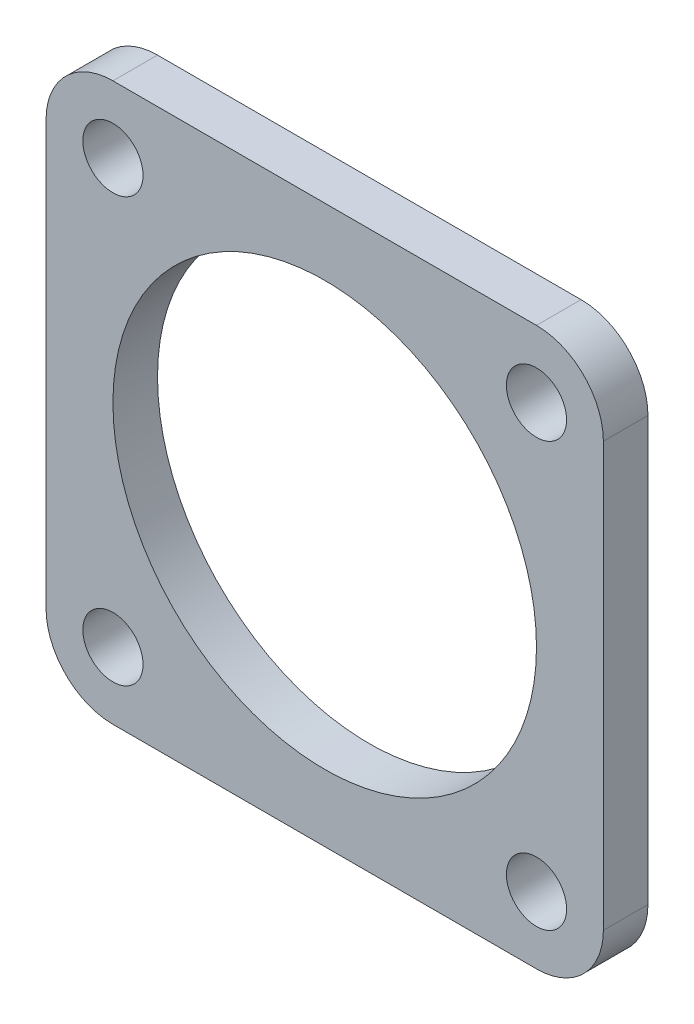
ISO-10303-21;
HEADER;
FILE_DESCRIPTION(('STEP AP214'),'2;1');
FILE_NAME('part.step','',(''),(''),'','','');
FILE_SCHEMA(('AUTOMOTIVE_DESIGN { 1 0 10303 214 1 1 1 1 }'));
ENDSEC;
DATA;
#1=APPLICATION_CONTEXT('core data for automotive mechanical design processes');
#2=APPLICATION_PROTOCOL_DEFINITION('international standard','automotive_design',2000,#1);
#3=PRODUCT_CONTEXT('',#1,'mechanical');
#4=PRODUCT('Part','Part','',(#3));
#5=PRODUCT_RELATED_PRODUCT_CATEGORY('part','',(#4));
#6=PRODUCT_DEFINITION_FORMATION('','',#4);
#7=PRODUCT_DEFINITION_CONTEXT('part definition',#1,'design');
#8=PRODUCT_DEFINITION('design','',#6,#7);
#9=PRODUCT_DEFINITION_SHAPE('','',#8);
#10=(LENGTH_UNIT() NAMED_UNIT(*) SI_UNIT(.MILLI.,.METRE.));
#11=(NAMED_UNIT(*) PLANE_ANGLE_UNIT() SI_UNIT($,.RADIAN.));
#12=(NAMED_UNIT(*) SI_UNIT($,.STERADIAN.) SOLID_ANGLE_UNIT());
#13=UNCERTAINTY_MEASURE_WITH_UNIT(LENGTH_MEASURE(1.E-05),#10,'distance_accuracy_value','');
#14=(GEOMETRIC_REPRESENTATION_CONTEXT(3) GLOBAL_UNCERTAINTY_ASSIGNED_CONTEXT((#13)) GLOBAL_UNIT_ASSIGNED_CONTEXT((#10,
#11,#12)) REPRESENTATION_CONTEXT('',''));
#15=CARTESIAN_POINT('',(0.,0.,0.));
#16=DIRECTION('',(0.,0.,1.));
#17=DIRECTION('',(1.,0.,0.));
#18=AXIS2_PLACEMENT_3D('',#15,#16,#17);
#19=CARTESIAN_POINT('',(0.,0.,1.));
#20=DIRECTION('',(0.,0.,-1.));
#21=DIRECTION('',(-1.,0.,0.));
#22=AXIS2_PLACEMENT_3D('',#19,#20,#21);
#23=PLANE('',#22);
#24=DIRECTION('',(1.,0.,0.));
#25=VECTOR('',#24,1.);
#26=CARTESIAN_POINT('',(-12.5,-12.5,1.));
#27=LINE('',#26,#25);
#28=CARTESIAN_POINT('',(-9.5,-12.5,1.));
#29=VERTEX_POINT('',#28);
#30=CARTESIAN_POINT('',(9.5,-12.5,1.));
#31=VERTEX_POINT('',#30);
#32=EDGE_CURVE('E146',#29,#31,#27,.T.);
#33=ORIENTED_EDGE('',*,*,#32,.T.);
#34=CARTESIAN_POINT('',(9.5,-9.5,1.));
#35=DIRECTION('',(0.,0.,-1.));
#36=DIRECTION('',(-1.,0.,0.));
#37=AXIS2_PLACEMENT_3D('',#34,#35,#36);
#38=CIRCLE('',#37,3.);
#39=CARTESIAN_POINT('',(12.5,-9.5,1.));
#40=VERTEX_POINT('',#39);
#41=EDGE_CURVE('E164',#31,#40,#38,.F.);
#42=ORIENTED_EDGE('',*,*,#41,.T.);
#43=DIRECTION('',(0.,1.,0.));
#44=VECTOR('',#43,1.);
#45=CARTESIAN_POINT('',(12.5,-12.5,1.));
#46=LINE('',#45,#44);
#47=CARTESIAN_POINT('',(12.5,9.5,1.));
#48=VERTEX_POINT('',#47);
#49=EDGE_CURVE('E128',#40,#48,#46,.T.);
#50=ORIENTED_EDGE('',*,*,#49,.T.);
#51=CARTESIAN_POINT('',(9.5,9.5,1.));
#52=DIRECTION('',(0.,0.,-1.));
#53=DIRECTION('',(-1.,0.,0.));
#54=AXIS2_PLACEMENT_3D('',#51,#52,#53);
#55=CIRCLE('',#54,3.);
#56=CARTESIAN_POINT('',(9.5,12.5,1.));
#57=VERTEX_POINT('',#56);
#58=EDGE_CURVE('E160',#48,#57,#55,.F.);
#59=ORIENTED_EDGE('',*,*,#58,.T.);
#60=DIRECTION('',(-1.,0.,0.));
#61=VECTOR('',#60,1.);
#62=CARTESIAN_POINT('',(-12.5,12.5,1.));
#63=LINE('',#62,#61);
#64=CARTESIAN_POINT('',(-9.5,12.5,1.));
#65=VERTEX_POINT('',#64);
#66=EDGE_CURVE('E173',#57,#65,#63,.T.);
#67=ORIENTED_EDGE('',*,*,#66,.T.);
#68=CARTESIAN_POINT('',(-9.5,9.5,1.));
#69=DIRECTION('',(0.,0.,-1.));
#70=DIRECTION('',(-1.,0.,0.));
#71=AXIS2_PLACEMENT_3D('',#68,#69,#70);
#72=CIRCLE('',#71,3.);
#73=CARTESIAN_POINT('',(-12.5,9.5,1.));
#74=VERTEX_POINT('',#73);
#75=EDGE_CURVE('E63',#65,#74,#72,.F.);
#76=ORIENTED_EDGE('',*,*,#75,.T.);
#77=DIRECTION('',(0.,-1.,0.));
#78=VECTOR('',#77,1.);
#79=CARTESIAN_POINT('',(-12.5,-12.5,1.));
#80=LINE('',#79,#78);
#81=CARTESIAN_POINT('',(-12.5,-9.5,1.));
#82=VERTEX_POINT('',#81);
#83=EDGE_CURVE('E179',#74,#82,#80,.T.);
#84=ORIENTED_EDGE('',*,*,#83,.T.);
#85=CARTESIAN_POINT('',(-9.5,-9.5,1.));
#86=DIRECTION('',(0.,0.,-1.));
#87=DIRECTION('',(-1.,0.,0.));
#88=AXIS2_PLACEMENT_3D('',#85,#86,#87);
#89=CIRCLE('',#88,3.);
#90=EDGE_CURVE('E162',#82,#29,#89,.F.);
#91=ORIENTED_EDGE('',*,*,#90,.T.);
#92=EDGE_LOOP('',(#33,#42,#50,#59,#67,#76,#84,#91));
#93=FACE_BOUND('',#92,.T.);
#94=CARTESIAN_POINT('',(-9.5,9.5,1.));
#95=DIRECTION('',(0.,0.,1.));
#96=DIRECTION('',(1.,0.,0.));
#97=AXIS2_PLACEMENT_3D('',#94,#95,#96);
#98=CIRCLE('',#97,1.35);
#99=CARTESIAN_POINT('',(-8.15,9.5,1.));
#100=VERTEX_POINT('',#99);
#101=EDGE_CURVE('E137',#100,#100,#98,.T.);
#102=ORIENTED_EDGE('',*,*,#101,.F.);
#103=EDGE_LOOP('',(#102));
#104=FACE_BOUND('',#103,.T.);
#105=CARTESIAN_POINT('',(9.5,9.50000000000001,1.));
#106=DIRECTION('',(0.,0.,1.));
#107=DIRECTION('',(1.,0.,0.));
#108=AXIS2_PLACEMENT_3D('',#105,#106,#107);
#109=CIRCLE('',#108,1.35);
#110=CARTESIAN_POINT('',(10.85,9.50000000000001,1.));
#111=VERTEX_POINT('',#110);
#112=EDGE_CURVE('E194',#111,#111,#109,.T.);
#113=ORIENTED_EDGE('',*,*,#112,.F.);
#114=EDGE_LOOP('',(#113));
#115=FACE_BOUND('',#114,.T.);
#116=CARTESIAN_POINT('',(9.5,-9.5,1.));
#117=DIRECTION('',(0.,0.,1.));
#118=DIRECTION('',(1.,0.,0.));
#119=AXIS2_PLACEMENT_3D('',#116,#117,#118);
#120=CIRCLE('',#119,1.35);
#121=CARTESIAN_POINT('',(10.85,-9.5,1.));
#122=VERTEX_POINT('',#121);
#123=EDGE_CURVE('E199',#122,#122,#120,.T.);
#124=ORIENTED_EDGE('',*,*,#123,.F.);
#125=EDGE_LOOP('',(#124));
#126=FACE_BOUND('',#125,.T.);
#127=CARTESIAN_POINT('',(-9.5,-9.5,1.));
#128=DIRECTION('',(0.,0.,1.));
#129=DIRECTION('',(1.,0.,0.));
#130=AXIS2_PLACEMENT_3D('',#127,#128,#129);
#131=CIRCLE('',#130,1.35);
#132=CARTESIAN_POINT('',(-8.15,-9.5,1.));
#133=VERTEX_POINT('',#132);
#134=EDGE_CURVE('E205',#133,#133,#131,.T.);
#135=ORIENTED_EDGE('',*,*,#134,.F.);
#136=EDGE_LOOP('',(#135));
#137=FACE_BOUND('',#136,.T.);
#138=CARTESIAN_POINT('',(0.,0.,1.));
#139=DIRECTION('',(0.,0.,1.));
#140=DIRECTION('',(1.,0.,0.));
#141=AXIS2_PLACEMENT_3D('',#138,#139,#140);
#142=CIRCLE('',#141,9.5);
#143=CARTESIAN_POINT('',(9.5,0.,1.));
#144=VERTEX_POINT('',#143);
#145=EDGE_CURVE('E211',#144,#144,#142,.T.);
#146=ORIENTED_EDGE('',*,*,#145,.F.);
#147=EDGE_LOOP('',(#146));
#148=FACE_BOUND('',#147,.T.);
#149=ADVANCED_FACE('F41',(#93,#104,#115,#126,#137,#148),#23,.F.);
#150=CARTESIAN_POINT('',(0.,0.,-1.));
#151=DIRECTION('',(0.,0.,-1.));
#152=DIRECTION('',(-1.,0.,0.));
#153=AXIS2_PLACEMENT_3D('',#150,#151,#152);
#154=PLANE('',#153);
#155=CARTESIAN_POINT('',(-9.5,-9.5,-1.));
#156=DIRECTION('',(0.,0.,1.));
#157=DIRECTION('',(1.,0.,0.));
#158=AXIS2_PLACEMENT_3D('',#155,#156,#157);
#159=CIRCLE('',#158,1.35);
#160=CARTESIAN_POINT('',(-8.15,-9.5,-1.));
#161=VERTEX_POINT('',#160);
#162=EDGE_CURVE('E208',#161,#161,#159,.T.);
#163=ORIENTED_EDGE('',*,*,#162,.T.);
#164=EDGE_LOOP('',(#163));
#165=FACE_BOUND('',#164,.T.);
#166=CARTESIAN_POINT('',(9.5,9.50000000000001,-1.));
#167=DIRECTION('',(0.,0.,1.));
#168=DIRECTION('',(1.,0.,0.));
#169=AXIS2_PLACEMENT_3D('',#166,#167,#168);
#170=CIRCLE('',#169,1.35);
#171=CARTESIAN_POINT('',(10.85,9.50000000000001,-1.));
#172=VERTEX_POINT('',#171);
#173=EDGE_CURVE('E196',#172,#172,#170,.T.);
#174=ORIENTED_EDGE('',*,*,#173,.T.);
#175=EDGE_LOOP('',(#174));
#176=FACE_BOUND('',#175,.T.);
#177=DIRECTION('',(0.,1.,0.));
#178=VECTOR('',#177,1.);
#179=CARTESIAN_POINT('',(12.5,-12.5,-1.));
#180=LINE('',#179,#178);
#181=CARTESIAN_POINT('',(12.5,-9.5,-1.));
#182=VERTEX_POINT('',#181);
#183=CARTESIAN_POINT('',(12.5,9.5,-1.));
#184=VERTEX_POINT('',#183);
#185=EDGE_CURVE('E125',#182,#184,#180,.T.);
#186=ORIENTED_EDGE('',*,*,#185,.F.);
#187=CARTESIAN_POINT('',(9.5,-9.5,-1.));
#188=DIRECTION('',(0.,0.,-1.));
#189=DIRECTION('',(-1.,0.,0.));
#190=AXIS2_PLACEMENT_3D('',#187,#188,#189);
#191=CIRCLE('',#190,3.);
#192=CARTESIAN_POINT('',(9.5,-12.5,-1.));
#193=VERTEX_POINT('',#192);
#194=EDGE_CURVE('E108',#182,#193,#191,.T.);
#195=ORIENTED_EDGE('',*,*,#194,.T.);
#196=DIRECTION('',(1.,0.,0.));
#197=VECTOR('',#196,1.);
#198=CARTESIAN_POINT('',(-12.5,-12.5,-1.));
#199=LINE('',#198,#197);
#200=CARTESIAN_POINT('',(-9.5,-12.5,-1.));
#201=VERTEX_POINT('',#200);
#202=EDGE_CURVE('E150',#201,#193,#199,.T.);
#203=ORIENTED_EDGE('',*,*,#202,.F.);
#204=CARTESIAN_POINT('',(-9.5,-9.5,-1.));
#205=DIRECTION('',(0.,0.,-1.));
#206=DIRECTION('',(-1.,0.,0.));
#207=AXIS2_PLACEMENT_3D('',#204,#205,#206);
#208=CIRCLE('',#207,3.);
#209=CARTESIAN_POINT('',(-12.5,-9.5,-1.));
#210=VERTEX_POINT('',#209);
#211=EDGE_CURVE('E119',#201,#210,#208,.T.);
#212=ORIENTED_EDGE('',*,*,#211,.T.);
#213=DIRECTION('',(0.,-1.,0.));
#214=VECTOR('',#213,1.);
#215=CARTESIAN_POINT('',(-12.5,-12.5,-1.));
#216=LINE('',#215,#214);
#217=CARTESIAN_POINT('',(-12.5,9.5,-1.));
#218=VERTEX_POINT('',#217);
#219=EDGE_CURVE('E140',#218,#210,#216,.T.);
#220=ORIENTED_EDGE('',*,*,#219,.F.);
#221=CARTESIAN_POINT('',(-9.5,9.5,-1.));
#222=DIRECTION('',(0.,0.,-1.));
#223=DIRECTION('',(-1.,0.,0.));
#224=AXIS2_PLACEMENT_3D('',#221,#222,#223);
#225=CIRCLE('',#224,3.);
#226=CARTESIAN_POINT('',(-9.5,12.5,-1.));
#227=VERTEX_POINT('',#226);
#228=EDGE_CURVE('E129',#218,#227,#225,.T.);
#229=ORIENTED_EDGE('',*,*,#228,.T.);
#230=DIRECTION('',(-1.,0.,0.));
#231=VECTOR('',#230,1.);
#232=CARTESIAN_POINT('',(-12.5,12.5,-1.));
#233=LINE('',#232,#231);
#234=CARTESIAN_POINT('',(9.5,12.5,-1.));
#235=VERTEX_POINT('',#234);
#236=EDGE_CURVE('E136',#235,#227,#233,.T.);
#237=ORIENTED_EDGE('',*,*,#236,.F.);
#238=CARTESIAN_POINT('',(9.5,9.5,-1.));
#239=DIRECTION('',(0.,0.,-1.));
#240=DIRECTION('',(-1.,0.,0.));
#241=AXIS2_PLACEMENT_3D('',#238,#239,#240);
#242=CIRCLE('',#241,3.);
#243=EDGE_CURVE('E135',#235,#184,#242,.T.);
#244=ORIENTED_EDGE('',*,*,#243,.T.);
#245=EDGE_LOOP('',(#186,#195,#203,#212,#220,#229,#237,#244));
#246=FACE_BOUND('',#245,.T.);
#247=CARTESIAN_POINT('',(-9.5,9.5,-1.));
#248=DIRECTION('',(0.,0.,1.));
#249=DIRECTION('',(1.,0.,0.));
#250=AXIS2_PLACEMENT_3D('',#247,#248,#249);
#251=CIRCLE('',#250,1.35);
#252=CARTESIAN_POINT('',(-8.15,9.5,-1.));
#253=VERTEX_POINT('',#252);
#254=EDGE_CURVE('E143',#253,#253,#251,.T.);
#255=ORIENTED_EDGE('',*,*,#254,.T.);
#256=EDGE_LOOP('',(#255));
#257=FACE_BOUND('',#256,.T.);
#258=CARTESIAN_POINT('',(9.5,-9.5,-1.));
#259=DIRECTION('',(0.,0.,1.));
#260=DIRECTION('',(1.,0.,0.));
#261=AXIS2_PLACEMENT_3D('',#258,#259,#260);
#262=CIRCLE('',#261,1.35);
#263=CARTESIAN_POINT('',(10.85,-9.5,-1.));
#264=VERTEX_POINT('',#263);
#265=EDGE_CURVE('E202',#264,#264,#262,.T.);
#266=ORIENTED_EDGE('',*,*,#265,.T.);
#267=EDGE_LOOP('',(#266));
#268=FACE_BOUND('',#267,.T.);
#269=CARTESIAN_POINT('',(0.,0.,-1.));
#270=DIRECTION('',(0.,0.,1.));
#271=DIRECTION('',(1.,0.,0.));
#272=AXIS2_PLACEMENT_3D('',#269,#270,#271);
#273=CIRCLE('',#272,9.5);
#274=CARTESIAN_POINT('',(9.5,0.,-1.));
#275=VERTEX_POINT('',#274);
#276=EDGE_CURVE('E214',#275,#275,#273,.T.);
#277=ORIENTED_EDGE('',*,*,#276,.T.);
#278=EDGE_LOOP('',(#277));
#279=FACE_BOUND('',#278,.T.);
#280=ADVANCED_FACE('F132',(#165,#176,#246,#257,#268,#279),#154,.T.);
#281=CARTESIAN_POINT('',(12.5,-12.5,1.));
#282=DIRECTION('',(-1.,0.,0.));
#283=DIRECTION('',(0.,0.,1.));
#284=AXIS2_PLACEMENT_3D('',#281,#282,#283);
#285=PLANE('',#284);
#286=ORIENTED_EDGE('',*,*,#49,.F.);
#287=DIRECTION('',(0.,0.,-1.));
#288=VECTOR('',#287,1.);
#289=CARTESIAN_POINT('',(12.5,-9.5,1.));
#290=LINE('',#289,#288);
#291=EDGE_CURVE('E112',#40,#182,#290,.T.);
#292=ORIENTED_EDGE('',*,*,#291,.T.);
#293=ORIENTED_EDGE('',*,*,#185,.T.);
#294=DIRECTION('',(0.,0.,-1.));
#295=VECTOR('',#294,1.);
#296=CARTESIAN_POINT('',(12.5,9.5,1.));
#297=LINE('',#296,#295);
#298=EDGE_CURVE('E130',#184,#48,#297,.F.);
#299=ORIENTED_EDGE('',*,*,#298,.T.);
#300=EDGE_LOOP('',(#286,#292,#293,#299));
#301=FACE_BOUND('',#300,.T.);
#302=ADVANCED_FACE('F124',(#301),#285,.F.);
#303=CARTESIAN_POINT('',(-12.5,12.5,1.));
#304=DIRECTION('',(0.,-1.,0.));
#305=DIRECTION('',(0.,0.,-1.));
#306=AXIS2_PLACEMENT_3D('',#303,#304,#305);
#307=PLANE('',#306);
#308=ORIENTED_EDGE('',*,*,#66,.F.);
#309=DIRECTION('',(0.,0.,-1.));
#310=VECTOR('',#309,1.);
#311=CARTESIAN_POINT('',(9.5,12.5,1.));
#312=LINE('',#311,#310);
#313=EDGE_CURVE('E11',#57,#235,#312,.T.);
#314=ORIENTED_EDGE('',*,*,#313,.T.);
#315=ORIENTED_EDGE('',*,*,#236,.T.);
#316=DIRECTION('',(0.,0.,-1.));
#317=VECTOR('',#316,1.);
#318=CARTESIAN_POINT('',(-9.5,12.5,1.));
#319=LINE('',#318,#317);
#320=EDGE_CURVE('E49',#227,#65,#319,.F.);
#321=ORIENTED_EDGE('',*,*,#320,.T.);
#322=EDGE_LOOP('',(#308,#314,#315,#321));
#323=FACE_BOUND('',#322,.T.);
#324=ADVANCED_FACE('F172',(#323),#307,.F.);
#325=CARTESIAN_POINT('',(-12.5,-12.5,1.));
#326=DIRECTION('',(1.,0.,0.));
#327=DIRECTION('',(0.,0.,-1.));
#328=AXIS2_PLACEMENT_3D('',#325,#326,#327);
#329=PLANE('',#328);
#330=ORIENTED_EDGE('',*,*,#219,.T.);
#331=DIRECTION('',(0.,0.,-1.));
#332=VECTOR('',#331,1.);
#333=CARTESIAN_POINT('',(-12.5,-9.5,1.));
#334=LINE('',#333,#332);
#335=EDGE_CURVE('E56',#210,#82,#334,.F.);
#336=ORIENTED_EDGE('',*,*,#335,.T.);
#337=ORIENTED_EDGE('',*,*,#83,.F.);
#338=DIRECTION('',(0.,0.,-1.));
#339=VECTOR('',#338,1.);
#340=CARTESIAN_POINT('',(-12.5,9.5,1.));
#341=LINE('',#340,#339);
#342=EDGE_CURVE('E166',#74,#218,#341,.T.);
#343=ORIENTED_EDGE('',*,*,#342,.T.);
#344=EDGE_LOOP('',(#330,#336,#337,#343));
#345=FACE_BOUND('',#344,.T.);
#346=ADVANCED_FACE('F183',(#345),#329,.F.);
#347=CARTESIAN_POINT('',(-12.5,-12.5,1.));
#348=DIRECTION('',(0.,1.,0.));
#349=DIRECTION('',(0.,0.,1.));
#350=AXIS2_PLACEMENT_3D('',#347,#348,#349);
#351=PLANE('',#350);
#352=ORIENTED_EDGE('',*,*,#202,.T.);
#353=DIRECTION('',(0.,0.,-1.));
#354=VECTOR('',#353,1.);
#355=CARTESIAN_POINT('',(9.5,-12.5,1.));
#356=LINE('',#355,#354);
#357=EDGE_CURVE('E113',#193,#31,#356,.F.);
#358=ORIENTED_EDGE('',*,*,#357,.T.);
#359=ORIENTED_EDGE('',*,*,#32,.F.);
#360=DIRECTION('',(0.,0.,-1.));
#361=VECTOR('',#360,1.);
#362=CARTESIAN_POINT('',(-9.5,-12.5,1.));
#363=LINE('',#362,#361);
#364=EDGE_CURVE('E118',#29,#201,#363,.T.);
#365=ORIENTED_EDGE('',*,*,#364,.T.);
#366=EDGE_LOOP('',(#352,#358,#359,#365));
#367=FACE_BOUND('',#366,.T.);
#368=ADVANCED_FACE('F190',(#367),#351,.F.);
#369=CARTESIAN_POINT('',(-9.5,9.5,1.));
#370=DIRECTION('',(0.,0.,-1.));
#371=DIRECTION('',(-1.,0.,0.));
#372=AXIS2_PLACEMENT_3D('',#369,#370,#371);
#373=CYLINDRICAL_SURFACE('',#372,1.35);
#374=ORIENTED_EDGE('',*,*,#101,.T.);
#375=EDGE_LOOP('',(#374));
#376=FACE_BOUND('',#375,.T.);
#377=ORIENTED_EDGE('',*,*,#254,.F.);
#378=EDGE_LOOP('',(#377));
#379=FACE_BOUND('',#378,.T.);
#380=ADVANCED_FACE('F232',(#376,#379),#373,.F.);
#381=CARTESIAN_POINT('',(9.5,9.50000000000001,1.));
#382=DIRECTION('',(0.,0.,-1.));
#383=DIRECTION('',(-1.,0.,0.));
#384=AXIS2_PLACEMENT_3D('',#381,#382,#383);
#385=CYLINDRICAL_SURFACE('',#384,1.35);
#386=ORIENTED_EDGE('',*,*,#112,.T.);
#387=EDGE_LOOP('',(#386));
#388=FACE_BOUND('',#387,.T.);
#389=ORIENTED_EDGE('',*,*,#173,.F.);
#390=EDGE_LOOP('',(#389));
#391=FACE_BOUND('',#390,.T.);
#392=ADVANCED_FACE('F298',(#388,#391),#385,.F.);
#393=CARTESIAN_POINT('',(9.5,-9.5,1.));
#394=DIRECTION('',(0.,0.,-1.));
#395=DIRECTION('',(-1.,0.,0.));
#396=AXIS2_PLACEMENT_3D('',#393,#394,#395);
#397=CYLINDRICAL_SURFACE('',#396,1.35);
#398=ORIENTED_EDGE('',*,*,#123,.T.);
#399=EDGE_LOOP('',(#398));
#400=FACE_BOUND('',#399,.T.);
#401=ORIENTED_EDGE('',*,*,#265,.F.);
#402=EDGE_LOOP('',(#401));
#403=FACE_BOUND('',#402,.T.);
#404=ADVANCED_FACE('F288',(#400,#403),#397,.F.);
#405=CARTESIAN_POINT('',(-9.5,-9.5,1.));
#406=DIRECTION('',(0.,0.,-1.));
#407=DIRECTION('',(-1.,0.,0.));
#408=AXIS2_PLACEMENT_3D('',#405,#406,#407);
#409=CYLINDRICAL_SURFACE('',#408,1.35);
#410=ORIENTED_EDGE('',*,*,#134,.T.);
#411=EDGE_LOOP('',(#410));
#412=FACE_BOUND('',#411,.T.);
#413=ORIENTED_EDGE('',*,*,#162,.F.);
#414=EDGE_LOOP('',(#413));
#415=FACE_BOUND('',#414,.T.);
#416=ADVANCED_FACE('F279',(#412,#415),#409,.F.);
#417=CARTESIAN_POINT('',(0.,0.,1.));
#418=DIRECTION('',(0.,0.,-1.));
#419=DIRECTION('',(-1.,0.,0.));
#420=AXIS2_PLACEMENT_3D('',#417,#418,#419);
#421=CYLINDRICAL_SURFACE('',#420,9.5);
#422=ORIENTED_EDGE('',*,*,#145,.T.);
#423=EDGE_LOOP('',(#422));
#424=FACE_BOUND('',#423,.T.);
#425=ORIENTED_EDGE('',*,*,#276,.F.);
#426=EDGE_LOOP('',(#425));
#427=FACE_BOUND('',#426,.T.);
#428=ADVANCED_FACE('F220',(#424,#427),#421,.F.);
#429=CARTESIAN_POINT('',(9.5,-9.5,1.));
#430=DIRECTION('',(0.,0.,-1.));
#431=DIRECTION('',(-1.,0.,0.));
#432=AXIS2_PLACEMENT_3D('',#429,#430,#431);
#433=CYLINDRICAL_SURFACE('',#432,3.);
#434=ORIENTED_EDGE('',*,*,#41,.F.);
#435=ORIENTED_EDGE('',*,*,#357,.F.);
#436=ORIENTED_EDGE('',*,*,#194,.F.);
#437=ORIENTED_EDGE('',*,*,#291,.F.);
#438=EDGE_LOOP('',(#434,#435,#436,#437));
#439=FACE_BOUND('',#438,.T.);
#440=ADVANCED_FACE('F111',(#439),#433,.T.);
#441=CARTESIAN_POINT('',(-9.5,-9.5,1.));
#442=DIRECTION('',(0.,0.,-1.));
#443=DIRECTION('',(-1.,0.,0.));
#444=AXIS2_PLACEMENT_3D('',#441,#442,#443);
#445=CYLINDRICAL_SURFACE('',#444,3.);
#446=ORIENTED_EDGE('',*,*,#90,.F.);
#447=ORIENTED_EDGE('',*,*,#335,.F.);
#448=ORIENTED_EDGE('',*,*,#211,.F.);
#449=ORIENTED_EDGE('',*,*,#364,.F.);
#450=EDGE_LOOP('',(#446,#447,#448,#449));
#451=FACE_BOUND('',#450,.T.);
#452=ADVANCED_FACE('F187',(#451),#445,.T.);
#453=CARTESIAN_POINT('',(9.5,9.5,1.));
#454=DIRECTION('',(0.,0.,-1.));
#455=DIRECTION('',(-1.,0.,0.));
#456=AXIS2_PLACEMENT_3D('',#453,#454,#455);
#457=CYLINDRICAL_SURFACE('',#456,3.);
#458=ORIENTED_EDGE('',*,*,#58,.F.);
#459=ORIENTED_EDGE('',*,*,#298,.F.);
#460=ORIENTED_EDGE('',*,*,#243,.F.);
#461=ORIENTED_EDGE('',*,*,#313,.F.);
#462=EDGE_LOOP('',(#458,#459,#460,#461));
#463=FACE_BOUND('',#462,.T.);
#464=ADVANCED_FACE('F246',(#463),#457,.T.);
#465=CARTESIAN_POINT('',(-9.5,9.5,1.));
#466=DIRECTION('',(0.,0.,-1.));
#467=DIRECTION('',(-1.,0.,0.));
#468=AXIS2_PLACEMENT_3D('',#465,#466,#467);
#469=CYLINDRICAL_SURFACE('',#468,3.);
#470=ORIENTED_EDGE('',*,*,#75,.F.);
#471=ORIENTED_EDGE('',*,*,#320,.F.);
#472=ORIENTED_EDGE('',*,*,#228,.F.);
#473=ORIENTED_EDGE('',*,*,#342,.F.);
#474=EDGE_LOOP('',(#470,#471,#472,#473));
#475=FACE_BOUND('',#474,.T.);
#476=ADVANCED_FACE('F43',(#475),#469,.T.);
#477=CLOSED_SHELL('',(#149,#280,#302,#324,#346,#368,#380,#392,#404,#416,#428,#440,#452,#464,#476));
#478=MANIFOLD_SOLID_BREP('B2',#477);
#479=ADVANCED_BREP_SHAPE_REPRESENTATION('',(#18,#478),#14);
#480=SHAPE_DEFINITION_REPRESENTATION(#9,#479);
ENDSEC;
END-ISO-10303-21;
